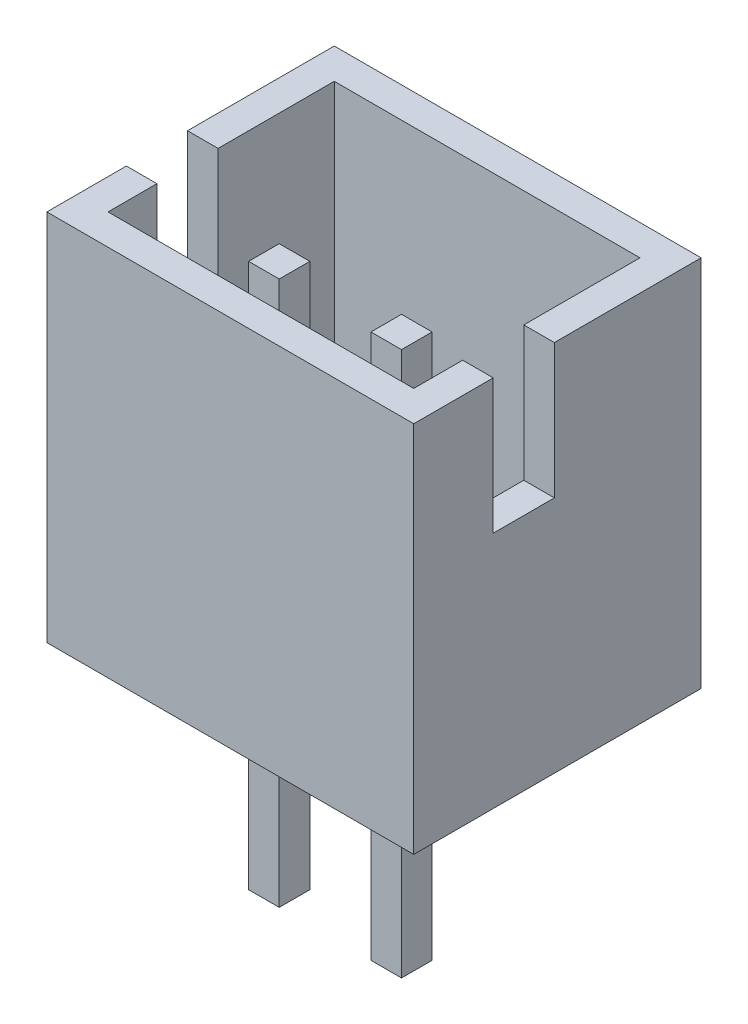
ISO-10303-21;
HEADER;
FILE_DESCRIPTION(('STEP AP214'),'2;1');
FILE_NAME('part.step','',(''),(''),'','','');
FILE_SCHEMA(('AUTOMOTIVE_DESIGN { 1 0 10303 214 1 1 1 1 }'));
ENDSEC;
DATA;
#1=APPLICATION_CONTEXT('core data for automotive mechanical design processes');
#2=APPLICATION_PROTOCOL_DEFINITION('international standard','automotive_design',2000,#1);
#3=PRODUCT_CONTEXT('',#1,'mechanical');
#4=PRODUCT('Part','Part','',(#3));
#5=PRODUCT_RELATED_PRODUCT_CATEGORY('part','',(#4));
#6=PRODUCT_DEFINITION_FORMATION('','',#4);
#7=PRODUCT_DEFINITION_CONTEXT('part definition',#1,'design');
#8=PRODUCT_DEFINITION('design','',#6,#7);
#9=PRODUCT_DEFINITION_SHAPE('','',#8);
#10=(LENGTH_UNIT() NAMED_UNIT(*) SI_UNIT(.MILLI.,.METRE.));
#11=(NAMED_UNIT(*) PLANE_ANGLE_UNIT() SI_UNIT($,.RADIAN.));
#12=(NAMED_UNIT(*) SI_UNIT($,.STERADIAN.) SOLID_ANGLE_UNIT());
#13=UNCERTAINTY_MEASURE_WITH_UNIT(LENGTH_MEASURE(1.E-05),#10,'distance_accuracy_value','');
#14=(GEOMETRIC_REPRESENTATION_CONTEXT(3) GLOBAL_UNCERTAINTY_ASSIGNED_CONTEXT((#13)) GLOBAL_UNIT_ASSIGNED_CONTEXT((#10,
#11,#12)) REPRESENTATION_CONTEXT('',''));
#15=CARTESIAN_POINT('',(0.,0.,0.));
#16=DIRECTION('',(0.,0.,1.));
#17=DIRECTION('',(1.,0.,0.));
#18=AXIS2_PLACEMENT_3D('',#15,#16,#17);
#19=CARTESIAN_POINT('',(0.75,-3.4,0.8));
#20=DIRECTION('',(-1.,0.,0.));
#21=DIRECTION('',(0.,0.,1.));
#22=AXIS2_PLACEMENT_3D('',#19,#20,#21);
#23=PLANE('',#22);
#24=DIRECTION('',(0.,1.,0.));
#25=VECTOR('',#24,1.);
#26=CARTESIAN_POINT('',(0.75,-3.4,0.8));
#27=LINE('',#26,#25);
#28=CARTESIAN_POINT('',(0.75,-3.4,0.8));
#29=VERTEX_POINT('',#28);
#30=CARTESIAN_POINT('',(0.75,5.5,0.8));
#31=VERTEX_POINT('',#30);
#32=EDGE_CURVE('E48',#29,#31,#27,.T.);
#33=ORIENTED_EDGE('',*,*,#32,.T.);
#34=DIRECTION('',(0.,0.,1.));
#35=VECTOR('',#34,1.);
#36=CARTESIAN_POINT('',(0.75,5.5,0.8));
#37=LINE('',#36,#35);
#38=CARTESIAN_POINT('',(0.75,5.5,0.3));
#39=VERTEX_POINT('',#38);
#40=EDGE_CURVE('E85',#39,#31,#37,.T.);
#41=ORIENTED_EDGE('',*,*,#40,.F.);
#42=DIRECTION('',(0.,1.,0.));
#43=VECTOR('',#42,1.);
#44=CARTESIAN_POINT('',(0.75,-3.4,0.3));
#45=LINE('',#44,#43);
#46=CARTESIAN_POINT('',(0.75,-3.4,0.3));
#47=VERTEX_POINT('',#46);
#48=EDGE_CURVE('E12',#47,#39,#45,.T.);
#49=ORIENTED_EDGE('',*,*,#48,.F.);
#50=DIRECTION('',(0.,0.,1.));
#51=VECTOR('',#50,1.);
#52=CARTESIAN_POINT('',(0.75,-3.4,0.8));
#53=LINE('',#52,#51);
#54=EDGE_CURVE('E86',#47,#29,#53,.T.);
#55=ORIENTED_EDGE('',*,*,#54,.T.);
#56=EDGE_LOOP('',(#33,#41,#49,#55));
#57=FACE_BOUND('',#56,.T.);
#58=ADVANCED_FACE('F45',(#57),#23,.T.);
#59=CARTESIAN_POINT('',(0.75,-3.4,0.3));
#60=DIRECTION('',(0.,0.,-1.));
#61=DIRECTION('',(-1.,0.,0.));
#62=AXIS2_PLACEMENT_3D('',#59,#60,#61);
#63=PLANE('',#62);
#64=ORIENTED_EDGE('',*,*,#48,.T.);
#65=DIRECTION('',(-1.,0.,0.));
#66=VECTOR('',#65,1.);
#67=CARTESIAN_POINT('',(0.75,5.5,0.3));
#68=LINE('',#67,#66);
#69=CARTESIAN_POINT('',(1.25,5.5,0.3));
#70=VERTEX_POINT('',#69);
#71=EDGE_CURVE('E102',#70,#39,#68,.T.);
#72=ORIENTED_EDGE('',*,*,#71,.F.);
#73=DIRECTION('',(0.,1.,0.));
#74=VECTOR('',#73,1.);
#75=CARTESIAN_POINT('',(1.25,-3.4,0.3));
#76=LINE('',#75,#74);
#77=CARTESIAN_POINT('',(1.25,-3.4,0.3));
#78=VERTEX_POINT('',#77);
#79=EDGE_CURVE('E53',#78,#70,#76,.T.);
#80=ORIENTED_EDGE('',*,*,#79,.F.);
#81=DIRECTION('',(-1.,0.,0.));
#82=VECTOR('',#81,1.);
#83=CARTESIAN_POINT('',(0.75,-3.4,0.3));
#84=LINE('',#83,#82);
#85=EDGE_CURVE('E91',#78,#47,#84,.T.);
#86=ORIENTED_EDGE('',*,*,#85,.T.);
#87=EDGE_LOOP('',(#64,#72,#80,#86));
#88=FACE_BOUND('',#87,.T.);
#89=ADVANCED_FACE('F117',(#88),#63,.T.);
#90=CARTESIAN_POINT('',(1.25,-3.4,0.800000000000001));
#91=DIRECTION('',(1.,0.,0.));
#92=DIRECTION('',(0.,0.,-1.));
#93=AXIS2_PLACEMENT_3D('',#90,#91,#92);
#94=PLANE('',#93);
#95=ORIENTED_EDGE('',*,*,#79,.T.);
#96=DIRECTION('',(0.,0.,-1.));
#97=VECTOR('',#96,1.);
#98=CARTESIAN_POINT('',(1.25,5.5,0.800000000000001));
#99=LINE('',#98,#97);
#100=CARTESIAN_POINT('',(1.25,5.5,0.800000000000001));
#101=VERTEX_POINT('',#100);
#102=EDGE_CURVE('E98',#101,#70,#99,.T.);
#103=ORIENTED_EDGE('',*,*,#102,.F.);
#104=DIRECTION('',(0.,1.,0.));
#105=VECTOR('',#104,1.);
#106=CARTESIAN_POINT('',(1.25,-3.4,0.800000000000001));
#107=LINE('',#106,#105);
#108=CARTESIAN_POINT('',(1.25,-3.4,0.800000000000001));
#109=VERTEX_POINT('',#108);
#110=EDGE_CURVE('E90',#109,#101,#107,.T.);
#111=ORIENTED_EDGE('',*,*,#110,.F.);
#112=DIRECTION('',(0.,0.,-1.));
#113=VECTOR('',#112,1.);
#114=CARTESIAN_POINT('',(1.25,-3.4,0.800000000000001));
#115=LINE('',#114,#113);
#116=EDGE_CURVE('E110',#109,#78,#115,.T.);
#117=ORIENTED_EDGE('',*,*,#116,.T.);
#118=EDGE_LOOP('',(#95,#103,#111,#117));
#119=FACE_BOUND('',#118,.T.);
#120=ADVANCED_FACE('F114',(#119),#94,.T.);
#121=CARTESIAN_POINT('',(0.75,-3.4,0.8));
#122=DIRECTION('',(0.,0.,1.));
#123=DIRECTION('',(1.,0.,0.));
#124=AXIS2_PLACEMENT_3D('',#121,#122,#123);
#125=PLANE('',#124);
#126=ORIENTED_EDGE('',*,*,#110,.T.);
#127=DIRECTION('',(1.,0.,0.));
#128=VECTOR('',#127,1.);
#129=CARTESIAN_POINT('',(0.75,5.5,0.8));
#130=LINE('',#129,#128);
#131=EDGE_CURVE('E93',#31,#101,#130,.T.);
#132=ORIENTED_EDGE('',*,*,#131,.F.);
#133=ORIENTED_EDGE('',*,*,#32,.F.);
#134=DIRECTION('',(1.,0.,0.));
#135=VECTOR('',#134,1.);
#136=CARTESIAN_POINT('',(0.75,-3.4,0.8));
#137=LINE('',#136,#135);
#138=EDGE_CURVE('E108',#29,#109,#137,.T.);
#139=ORIENTED_EDGE('',*,*,#138,.T.);
#140=EDGE_LOOP('',(#126,#132,#133,#139));
#141=FACE_BOUND('',#140,.T.);
#142=ADVANCED_FACE('F94',(#141),#125,.T.);
#143=CARTESIAN_POINT('',(0.,-3.4,0.));
#144=DIRECTION('',(0.,-1.,0.));
#145=DIRECTION('',(0.,0.,-1.));
#146=AXIS2_PLACEMENT_3D('',#143,#144,#145);
#147=PLANE('',#146);
#148=ORIENTED_EDGE('',*,*,#54,.F.);
#149=ORIENTED_EDGE('',*,*,#85,.F.);
#150=ORIENTED_EDGE('',*,*,#116,.F.);
#151=ORIENTED_EDGE('',*,*,#138,.F.);
#152=EDGE_LOOP('',(#148,#149,#150,#151));
#153=FACE_BOUND('',#152,.T.);
#154=ADVANCED_FACE('F119',(#153),#147,.T.);
#155=CARTESIAN_POINT('',(0.,5.5,0.));
#156=DIRECTION('',(0.,-1.,0.));
#157=DIRECTION('',(0.,0.,-1.));
#158=AXIS2_PLACEMENT_3D('',#155,#156,#157);
#159=PLANE('',#158);
#160=ORIENTED_EDGE('',*,*,#40,.T.);
#161=ORIENTED_EDGE('',*,*,#131,.T.);
#162=ORIENTED_EDGE('',*,*,#102,.T.);
#163=ORIENTED_EDGE('',*,*,#71,.T.);
#164=EDGE_LOOP('',(#160,#161,#162,#163));
#165=FACE_BOUND('',#164,.T.);
#166=ADVANCED_FACE('F101',(#165),#159,.F.);
#167=CLOSED_SHELL('',(#58,#89,#120,#142,#154,#166));
#168=MANIFOLD_SOLID_BREP('B2',#167);
#169=CARTESIAN_POINT('',(-1.25,-3.4,0.800000000000001));
#170=DIRECTION('',(-1.,0.,0.));
#171=DIRECTION('',(0.,0.,1.));
#172=AXIS2_PLACEMENT_3D('',#169,#170,#171);
#173=PLANE('',#172);
#174=DIRECTION('',(0.,1.,0.));
#175=VECTOR('',#174,1.);
#176=CARTESIAN_POINT('',(-1.25,-3.4,0.800000000000001));
#177=LINE('',#176,#175);
#178=CARTESIAN_POINT('',(-1.25,-3.4,0.800000000000001));
#179=VERTEX_POINT('',#178);
#180=CARTESIAN_POINT('',(-1.25,5.5,0.800000000000001));
#181=VERTEX_POINT('',#180);
#182=EDGE_CURVE('E180',#179,#181,#177,.T.);
#183=ORIENTED_EDGE('',*,*,#182,.T.);
#184=DIRECTION('',(0.,0.,1.));
#185=VECTOR('',#184,1.);
#186=CARTESIAN_POINT('',(-1.25,5.5,0.800000000000001));
#187=LINE('',#186,#185);
#188=CARTESIAN_POINT('',(-1.25,5.5,0.3));
#189=VERTEX_POINT('',#188);
#190=EDGE_CURVE('E217',#189,#181,#187,.T.);
#191=ORIENTED_EDGE('',*,*,#190,.F.);
#192=DIRECTION('',(0.,1.,0.));
#193=VECTOR('',#192,1.);
#194=CARTESIAN_POINT('',(-1.25,-3.4,0.3));
#195=LINE('',#194,#193);
#196=CARTESIAN_POINT('',(-1.25,-3.4,0.3));
#197=VERTEX_POINT('',#196);
#198=EDGE_CURVE('E43',#197,#189,#195,.T.);
#199=ORIENTED_EDGE('',*,*,#198,.F.);
#200=DIRECTION('',(0.,0.,1.));
#201=VECTOR('',#200,1.);
#202=CARTESIAN_POINT('',(-1.25,-3.4,0.800000000000001));
#203=LINE('',#202,#201);
#204=EDGE_CURVE('E218',#197,#179,#203,.T.);
#205=ORIENTED_EDGE('',*,*,#204,.T.);
#206=EDGE_LOOP('',(#183,#191,#199,#205));
#207=FACE_BOUND('',#206,.T.);
#208=ADVANCED_FACE('F177',(#207),#173,.T.);
#209=CARTESIAN_POINT('',(-0.75,-3.4,0.3));
#210=DIRECTION('',(0.,0.,-1.));
#211=DIRECTION('',(-1.,0.,0.));
#212=AXIS2_PLACEMENT_3D('',#209,#210,#211);
#213=PLANE('',#212);
#214=ORIENTED_EDGE('',*,*,#198,.T.);
#215=DIRECTION('',(-1.,0.,0.));
#216=VECTOR('',#215,1.);
#217=CARTESIAN_POINT('',(-0.75,5.5,0.3));
#218=LINE('',#217,#216);
#219=CARTESIAN_POINT('',(-0.75,5.5,0.3));
#220=VERTEX_POINT('',#219);
#221=EDGE_CURVE('E234',#220,#189,#218,.T.);
#222=ORIENTED_EDGE('',*,*,#221,.F.);
#223=DIRECTION('',(0.,1.,0.));
#224=VECTOR('',#223,1.);
#225=CARTESIAN_POINT('',(-0.75,-3.4,0.3));
#226=LINE('',#225,#224);
#227=CARTESIAN_POINT('',(-0.75,-3.4,0.3));
#228=VERTEX_POINT('',#227);
#229=EDGE_CURVE('E185',#228,#220,#226,.T.);
#230=ORIENTED_EDGE('',*,*,#229,.F.);
#231=DIRECTION('',(-1.,0.,0.));
#232=VECTOR('',#231,1.);
#233=CARTESIAN_POINT('',(-0.75,-3.4,0.3));
#234=LINE('',#233,#232);
#235=EDGE_CURVE('E223',#228,#197,#234,.T.);
#236=ORIENTED_EDGE('',*,*,#235,.T.);
#237=EDGE_LOOP('',(#214,#222,#230,#236));
#238=FACE_BOUND('',#237,.T.);
#239=ADVANCED_FACE('F249',(#238),#213,.T.);
#240=CARTESIAN_POINT('',(-0.75,-3.4,0.8));
#241=DIRECTION('',(1.,0.,0.));
#242=DIRECTION('',(0.,0.,-1.));
#243=AXIS2_PLACEMENT_3D('',#240,#241,#242);
#244=PLANE('',#243);
#245=ORIENTED_EDGE('',*,*,#229,.T.);
#246=DIRECTION('',(0.,0.,-1.));
#247=VECTOR('',#246,1.);
#248=CARTESIAN_POINT('',(-0.75,5.5,0.8));
#249=LINE('',#248,#247);
#250=CARTESIAN_POINT('',(-0.75,5.5,0.8));
#251=VERTEX_POINT('',#250);
#252=EDGE_CURVE('E230',#251,#220,#249,.T.);
#253=ORIENTED_EDGE('',*,*,#252,.F.);
#254=DIRECTION('',(0.,1.,0.));
#255=VECTOR('',#254,1.);
#256=CARTESIAN_POINT('',(-0.75,-3.4,0.8));
#257=LINE('',#256,#255);
#258=CARTESIAN_POINT('',(-0.75,-3.4,0.8));
#259=VERTEX_POINT('',#258);
#260=EDGE_CURVE('E222',#259,#251,#257,.T.);
#261=ORIENTED_EDGE('',*,*,#260,.F.);
#262=DIRECTION('',(0.,0.,-1.));
#263=VECTOR('',#262,1.);
#264=CARTESIAN_POINT('',(-0.75,-3.4,0.8));
#265=LINE('',#264,#263);
#266=EDGE_CURVE('E242',#259,#228,#265,.T.);
#267=ORIENTED_EDGE('',*,*,#266,.T.);
#268=EDGE_LOOP('',(#245,#253,#261,#267));
#269=FACE_BOUND('',#268,.T.);
#270=ADVANCED_FACE('F246',(#269),#244,.T.);
#271=CARTESIAN_POINT('',(-0.75,-3.4,0.8));
#272=DIRECTION('',(0.,0.,1.));
#273=DIRECTION('',(1.,0.,0.));
#274=AXIS2_PLACEMENT_3D('',#271,#272,#273);
#275=PLANE('',#274);
#276=ORIENTED_EDGE('',*,*,#260,.T.);
#277=DIRECTION('',(1.,0.,0.));
#278=VECTOR('',#277,1.);
#279=CARTESIAN_POINT('',(-0.75,5.5,0.8));
#280=LINE('',#279,#278);
#281=EDGE_CURVE('E225',#181,#251,#280,.T.);
#282=ORIENTED_EDGE('',*,*,#281,.F.);
#283=ORIENTED_EDGE('',*,*,#182,.F.);
#284=DIRECTION('',(1.,0.,0.));
#285=VECTOR('',#284,1.);
#286=CARTESIAN_POINT('',(-0.75,-3.4,0.8));
#287=LINE('',#286,#285);
#288=EDGE_CURVE('E240',#179,#259,#287,.T.);
#289=ORIENTED_EDGE('',*,*,#288,.T.);
#290=EDGE_LOOP('',(#276,#282,#283,#289));
#291=FACE_BOUND('',#290,.T.);
#292=ADVANCED_FACE('F226',(#291),#275,.T.);
#293=CARTESIAN_POINT('',(0.,-3.4,0.));
#294=DIRECTION('',(0.,1.,0.));
#295=DIRECTION('',(0.,0.,1.));
#296=AXIS2_PLACEMENT_3D('',#293,#294,#295);
#297=PLANE('',#296);
#298=ORIENTED_EDGE('',*,*,#204,.F.);
#299=ORIENTED_EDGE('',*,*,#235,.F.);
#300=ORIENTED_EDGE('',*,*,#266,.F.);
#301=ORIENTED_EDGE('',*,*,#288,.F.);
#302=EDGE_LOOP('',(#298,#299,#300,#301));
#303=FACE_BOUND('',#302,.T.);
#304=ADVANCED_FACE('F251',(#303),#297,.F.);
#305=CARTESIAN_POINT('',(0.,5.5,0.));
#306=DIRECTION('',(0.,1.,0.));
#307=DIRECTION('',(0.,0.,1.));
#308=AXIS2_PLACEMENT_3D('',#305,#306,#307);
#309=PLANE('',#308);
#310=ORIENTED_EDGE('',*,*,#190,.T.);
#311=ORIENTED_EDGE('',*,*,#281,.T.);
#312=ORIENTED_EDGE('',*,*,#252,.T.);
#313=ORIENTED_EDGE('',*,*,#221,.T.);
#314=EDGE_LOOP('',(#310,#311,#312,#313));
#315=FACE_BOUND('',#314,.T.);
#316=ADVANCED_FACE('F233',(#315),#309,.T.);
#317=CLOSED_SHELL('',(#208,#239,#270,#292,#304,#316));
#318=MANIFOLD_SOLID_BREP('B6',#317);
#319=CARTESIAN_POINT('',(3.,6.1,2.35));
#320=DIRECTION('',(-1.,0.,0.));
#321=DIRECTION('',(0.,0.,1.));
#322=AXIS2_PLACEMENT_3D('',#319,#320,#321);
#323=PLANE('',#322);
#324=DIRECTION('',(0.,1.,0.));
#325=VECTOR('',#324,1.);
#326=CARTESIAN_POINT('',(3.,3.9,1.05));
#327=LINE('',#326,#325);
#328=CARTESIAN_POINT('',(3.,3.9,1.05));
#329=VERTEX_POINT('',#328);
#330=CARTESIAN_POINT('',(3.,6.1,1.05));
#331=VERTEX_POINT('',#330);
#332=EDGE_CURVE('E419',#329,#331,#327,.T.);
#333=ORIENTED_EDGE('',*,*,#332,.T.);
#334=DIRECTION('',(0.,0.,-1.));
#335=VECTOR('',#334,1.);
#336=CARTESIAN_POINT('',(3.,6.1,2.35));
#337=LINE('',#336,#335);
#338=CARTESIAN_POINT('',(3.,6.1,2.35));
#339=VERTEX_POINT('',#338);
#340=EDGE_CURVE('E435',#339,#331,#337,.T.);
#341=ORIENTED_EDGE('',*,*,#340,.F.);
#342=DIRECTION('',(0.,-1.,0.));
#343=VECTOR('',#342,1.);
#344=CARTESIAN_POINT('',(3.,6.1,2.35));
#345=LINE('',#344,#343);
#346=CARTESIAN_POINT('',(3.,0.,2.35));
#347=VERTEX_POINT('',#346);
#348=EDGE_CURVE('E460',#339,#347,#345,.T.);
#349=ORIENTED_EDGE('',*,*,#348,.T.);
#350=DIRECTION('',(0.,0.,-1.));
#351=VECTOR('',#350,1.);
#352=CARTESIAN_POINT('',(3.,0.,2.35));
#353=LINE('',#352,#351);
#354=CARTESIAN_POINT('',(3.,0.,-2.35));
#355=VERTEX_POINT('',#354);
#356=EDGE_CURVE('E452',#347,#355,#353,.T.);
#357=ORIENTED_EDGE('',*,*,#356,.T.);
#358=DIRECTION('',(0.,-1.,0.));
#359=VECTOR('',#358,1.);
#360=CARTESIAN_POINT('',(3.,6.1,-2.35));
#361=LINE('',#360,#359);
#362=CARTESIAN_POINT('',(3.,6.1,-2.35));
#363=VERTEX_POINT('',#362);
#364=EDGE_CURVE('E433',#363,#355,#361,.T.);
#365=ORIENTED_EDGE('',*,*,#364,.F.);
#366=CARTESIAN_POINT('',(3.,6.1,0.0500000000000005));
#367=VERTEX_POINT('',#366);
#368=EDGE_CURVE('E424',#367,#363,#337,.T.);
#369=ORIENTED_EDGE('',*,*,#368,.F.);
#370=DIRECTION('',(0.,-1.,0.));
#371=VECTOR('',#370,1.);
#372=CARTESIAN_POINT('',(3.,3.9,0.0500000000000005));
#373=LINE('',#372,#371);
#374=CARTESIAN_POINT('',(3.,3.9,0.0500000000000005));
#375=VERTEX_POINT('',#374);
#376=EDGE_CURVE('E411',#367,#375,#373,.T.);
#377=ORIENTED_EDGE('',*,*,#376,.T.);
#378=DIRECTION('',(0.,0.,1.));
#379=VECTOR('',#378,1.);
#380=CARTESIAN_POINT('',(3.,3.9,1.05));
#381=LINE('',#380,#379);
#382=EDGE_CURVE('E429',#375,#329,#381,.T.);
#383=ORIENTED_EDGE('',*,*,#382,.T.);
#384=EDGE_LOOP('',(#333,#341,#349,#357,#365,#369,#377,#383));
#385=FACE_BOUND('',#384,.T.);
#386=ADVANCED_FACE('F300',(#385),#323,.F.);
#387=CARTESIAN_POINT('',(0.,6.1,0.));
#388=DIRECTION('',(0.,1.,0.));
#389=DIRECTION('',(0.,0.,1.));
#390=AXIS2_PLACEMENT_3D('',#387,#388,#389);
#391=PLANE('',#390);
#392=ORIENTED_EDGE('',*,*,#340,.T.);
#393=DIRECTION('',(1.,0.,0.));
#394=VECTOR('',#393,1.);
#395=CARTESIAN_POINT('',(-4.91660919471891,6.1,1.05));
#396=LINE('',#395,#394);
#397=CARTESIAN_POINT('',(2.5,6.1,1.05));
#398=VERTEX_POINT('',#397);
#399=EDGE_CURVE('E428',#398,#331,#396,.T.);
#400=ORIENTED_EDGE('',*,*,#399,.F.);
#401=DIRECTION('',(0.,0.,-1.));
#402=VECTOR('',#401,1.);
#403=CARTESIAN_POINT('',(2.5,6.1,2.35));
#404=LINE('',#403,#402);
#405=CARTESIAN_POINT('',(2.5,6.1,1.85));
#406=VERTEX_POINT('',#405);
#407=EDGE_CURVE('E535',#406,#398,#404,.T.);
#408=ORIENTED_EDGE('',*,*,#407,.F.);
#409=DIRECTION('',(1.,0.,0.));
#410=VECTOR('',#409,1.);
#411=CARTESIAN_POINT('',(3.,6.1,1.85));
#412=LINE('',#411,#410);
#413=CARTESIAN_POINT('',(-2.5,6.1,1.85));
#414=VERTEX_POINT('',#413);
#415=EDGE_CURVE('E533',#414,#406,#412,.T.);
#416=ORIENTED_EDGE('',*,*,#415,.F.);
#417=DIRECTION('',(0.,0.,1.));
#418=VECTOR('',#417,1.);
#419=CARTESIAN_POINT('',(-2.5,6.1,2.35));
#420=LINE('',#419,#418);
#421=CARTESIAN_POINT('',(-2.5,6.1,1.05));
#422=VERTEX_POINT('',#421);
#423=EDGE_CURVE('E529',#422,#414,#420,.T.);
#424=ORIENTED_EDGE('',*,*,#423,.F.);
#425=DIRECTION('',(-1.,0.,0.));
#426=VECTOR('',#425,1.);
#427=CARTESIAN_POINT('',(-0.0833908052810871,6.1,1.05));
#428=LINE('',#427,#426);
#429=CARTESIAN_POINT('',(-3.,6.1,1.05));
#430=VERTEX_POINT('',#429);
#431=EDGE_CURVE('E502',#422,#430,#428,.T.);
#432=ORIENTED_EDGE('',*,*,#431,.T.);
#433=DIRECTION('',(0.,0.,1.));
#434=VECTOR('',#433,1.);
#435=CARTESIAN_POINT('',(-3.,6.1,2.35));
#436=LINE('',#435,#434);
#437=CARTESIAN_POINT('',(-3.,6.1,2.35));
#438=VERTEX_POINT('',#437);
#439=EDGE_CURVE('E456',#430,#438,#436,.T.);
#440=ORIENTED_EDGE('',*,*,#439,.T.);
#441=DIRECTION('',(1.,0.,0.));
#442=VECTOR('',#441,1.);
#443=CARTESIAN_POINT('',(3.,6.1,2.35));
#444=LINE('',#443,#442);
#445=EDGE_CURVE('E436',#438,#339,#444,.T.);
#446=ORIENTED_EDGE('',*,*,#445,.T.);
#447=EDGE_LOOP('',(#392,#400,#408,#416,#424,#432,#440,#446));
#448=FACE_BOUND('',#447,.T.);
#449=ADVANCED_FACE('F543',(#448),#391,.T.);
#450=CARTESIAN_POINT('',(2.5,6.1,0.0500000000000006));
#451=VERTEX_POINT('',#450);
#452=CARTESIAN_POINT('',(2.5,6.1,-1.85));
#453=VERTEX_POINT('',#452);
#454=EDGE_CURVE('E427',#451,#453,#404,.T.);
#455=ORIENTED_EDGE('',*,*,#454,.F.);
#456=DIRECTION('',(1.,0.,0.));
#457=VECTOR('',#456,1.);
#458=CARTESIAN_POINT('',(-4.91660919471891,6.1,0.0500000000000005));
#459=LINE('',#458,#457);
#460=EDGE_CURVE('E315',#451,#367,#459,.T.);
#461=ORIENTED_EDGE('',*,*,#460,.T.);
#462=ORIENTED_EDGE('',*,*,#368,.T.);
#463=DIRECTION('',(-1.,0.,0.));
#464=VECTOR('',#463,1.);
#465=CARTESIAN_POINT('',(3.,6.1,-2.35));
#466=LINE('',#465,#464);
#467=CARTESIAN_POINT('',(-3.,6.1,-2.35));
#468=VERTEX_POINT('',#467);
#469=EDGE_CURVE('E439',#363,#468,#466,.T.);
#470=ORIENTED_EDGE('',*,*,#469,.T.);
#471=CARTESIAN_POINT('',(-3.,6.1,0.0500000000000005));
#472=VERTEX_POINT('',#471);
#473=EDGE_CURVE('E440',#468,#472,#436,.T.);
#474=ORIENTED_EDGE('',*,*,#473,.T.);
#475=DIRECTION('',(-1.,0.,0.));
#476=VECTOR('',#475,1.);
#477=CARTESIAN_POINT('',(-0.0833908052810871,6.1,0.0500000000000005));
#478=LINE('',#477,#476);
#479=CARTESIAN_POINT('',(-2.5,6.1,0.0500000000000003));
#480=VERTEX_POINT('',#479);
#481=EDGE_CURVE('E498',#480,#472,#478,.T.);
#482=ORIENTED_EDGE('',*,*,#481,.F.);
#483=CARTESIAN_POINT('',(-2.5,6.1,-1.85));
#484=VERTEX_POINT('',#483);
#485=EDGE_CURVE('E530',#484,#480,#420,.T.);
#486=ORIENTED_EDGE('',*,*,#485,.F.);
#487=DIRECTION('',(-1.,0.,0.));
#488=VECTOR('',#487,1.);
#489=CARTESIAN_POINT('',(3.,6.1,-1.85));
#490=LINE('',#489,#488);
#491=EDGE_CURVE('E519',#453,#484,#490,.T.);
#492=ORIENTED_EDGE('',*,*,#491,.F.);
#493=EDGE_LOOP('',(#455,#461,#462,#470,#474,#482,#486,#492));
#494=FACE_BOUND('',#493,.T.);
#495=ADVANCED_FACE('F423',(#494),#391,.T.);
#496=CARTESIAN_POINT('',(2.5,6.1,2.35));
#497=DIRECTION('',(-1.,0.,0.));
#498=DIRECTION('',(0.,0.,1.));
#499=AXIS2_PLACEMENT_3D('',#496,#497,#498);
#500=PLANE('',#499);
#501=ORIENTED_EDGE('',*,*,#407,.T.);
#502=DIRECTION('',(0.,-1.,0.));
#503=VECTOR('',#502,1.);
#504=CARTESIAN_POINT('',(2.5,6.1,1.05));
#505=LINE('',#504,#503);
#506=CARTESIAN_POINT('',(2.5,3.9,1.05));
#507=VERTEX_POINT('',#506);
#508=EDGE_CURVE('E175',#398,#507,#505,.T.);
#509=ORIENTED_EDGE('',*,*,#508,.T.);
#510=DIRECTION('',(0.,0.,-1.));
#511=VECTOR('',#510,1.);
#512=CARTESIAN_POINT('',(2.5,3.9,2.35));
#513=LINE('',#512,#511);
#514=CARTESIAN_POINT('',(2.5,3.9,0.0500000000000005));
#515=VERTEX_POINT('',#514);
#516=EDGE_CURVE('E308',#507,#515,#513,.T.);
#517=ORIENTED_EDGE('',*,*,#516,.T.);
#518=DIRECTION('',(0.,1.,0.));
#519=VECTOR('',#518,1.);
#520=CARTESIAN_POINT('',(2.5,6.1,0.0500000000000006));
#521=LINE('',#520,#519);
#522=EDGE_CURVE('E466',#515,#451,#521,.T.);
#523=ORIENTED_EDGE('',*,*,#522,.T.);
#524=ORIENTED_EDGE('',*,*,#454,.T.);
#525=DIRECTION('',(0.,-1.,0.));
#526=VECTOR('',#525,1.);
#527=CARTESIAN_POINT('',(2.5,6.1,-1.85));
#528=LINE('',#527,#526);
#529=CARTESIAN_POINT('',(2.5,0.5,-1.85));
#530=VERTEX_POINT('',#529);
#531=EDGE_CURVE('E518',#453,#530,#528,.T.);
#532=ORIENTED_EDGE('',*,*,#531,.T.);
#533=DIRECTION('',(0.,0.,-1.));
#534=VECTOR('',#533,1.);
#535=CARTESIAN_POINT('',(2.5,0.5,2.35));
#536=LINE('',#535,#534);
#537=CARTESIAN_POINT('',(2.5,0.5,1.85));
#538=VERTEX_POINT('',#537);
#539=EDGE_CURVE('E521',#538,#530,#536,.T.);
#540=ORIENTED_EDGE('',*,*,#539,.F.);
#541=DIRECTION('',(0.,-1.,0.));
#542=VECTOR('',#541,1.);
#543=CARTESIAN_POINT('',(2.5,6.1,1.85));
#544=LINE('',#543,#542);
#545=EDGE_CURVE('E514',#406,#538,#544,.T.);
#546=ORIENTED_EDGE('',*,*,#545,.F.);
#547=EDGE_LOOP('',(#501,#509,#517,#523,#524,#532,#540,#546));
#548=FACE_BOUND('',#547,.T.);
#549=ADVANCED_FACE('F470',(#548),#500,.T.);
#550=CARTESIAN_POINT('',(-3.,6.1,2.35));
#551=DIRECTION('',(1.,0.,0.));
#552=DIRECTION('',(0.,0.,-1.));
#553=AXIS2_PLACEMENT_3D('',#550,#551,#552);
#554=PLANE('',#553);
#555=ORIENTED_EDGE('',*,*,#439,.F.);
#556=DIRECTION('',(0.,1.,0.));
#557=VECTOR('',#556,1.);
#558=CARTESIAN_POINT('',(-3.,3.9,1.05));
#559=LINE('',#558,#557);
#560=CARTESIAN_POINT('',(-3.,3.9,1.05));
#561=VERTEX_POINT('',#560);
#562=EDGE_CURVE('E485',#561,#430,#559,.T.);
#563=ORIENTED_EDGE('',*,*,#562,.F.);
#564=DIRECTION('',(0.,0.,1.));
#565=VECTOR('',#564,1.);
#566=CARTESIAN_POINT('',(-3.,3.9,1.05));
#567=LINE('',#566,#565);
#568=CARTESIAN_POINT('',(-3.,3.9,0.0500000000000005));
#569=VERTEX_POINT('',#568);
#570=EDGE_CURVE('E488',#569,#561,#567,.T.);
#571=ORIENTED_EDGE('',*,*,#570,.F.);
#572=DIRECTION('',(0.,-1.,0.));
#573=VECTOR('',#572,1.);
#574=CARTESIAN_POINT('',(-3.,3.9,0.0500000000000005));
#575=LINE('',#574,#573);
#576=EDGE_CURVE('E480',#472,#569,#575,.T.);
#577=ORIENTED_EDGE('',*,*,#576,.F.);
#578=ORIENTED_EDGE('',*,*,#473,.F.);
#579=DIRECTION('',(0.,-1.,0.));
#580=VECTOR('',#579,1.);
#581=CARTESIAN_POINT('',(-3.,6.1,-2.35));
#582=LINE('',#581,#580);
#583=CARTESIAN_POINT('',(-3.,0.,-2.35));
#584=VERTEX_POINT('',#583);
#585=EDGE_CURVE('E445',#468,#584,#582,.T.);
#586=ORIENTED_EDGE('',*,*,#585,.T.);
#587=DIRECTION('',(0.,0.,1.));
#588=VECTOR('',#587,1.);
#589=CARTESIAN_POINT('',(-3.,0.,2.35));
#590=LINE('',#589,#588);
#591=CARTESIAN_POINT('',(-3.,0.,2.35));
#592=VERTEX_POINT('',#591);
#593=EDGE_CURVE('E446',#584,#592,#590,.T.);
#594=ORIENTED_EDGE('',*,*,#593,.T.);
#595=DIRECTION('',(0.,-1.,0.));
#596=VECTOR('',#595,1.);
#597=CARTESIAN_POINT('',(-3.,6.1,2.35));
#598=LINE('',#597,#596);
#599=EDGE_CURVE('E463',#438,#592,#598,.T.);
#600=ORIENTED_EDGE('',*,*,#599,.F.);
#601=EDGE_LOOP('',(#555,#563,#571,#577,#578,#586,#594,#600));
#602=FACE_BOUND('',#601,.T.);
#603=ADVANCED_FACE('F302',(#602),#554,.F.);
#604=CARTESIAN_POINT('',(3.,6.1,2.35));
#605=DIRECTION('',(0.,0.,-1.));
#606=DIRECTION('',(-1.,0.,0.));
#607=AXIS2_PLACEMENT_3D('',#604,#605,#606);
#608=PLANE('',#607);
#609=DIRECTION('',(1.,0.,0.));
#610=VECTOR('',#609,1.);
#611=CARTESIAN_POINT('',(3.,0.,2.35));
#612=LINE('',#611,#610);
#613=EDGE_CURVE('E449',#592,#347,#612,.T.);
#614=ORIENTED_EDGE('',*,*,#613,.T.);
#615=ORIENTED_EDGE('',*,*,#348,.F.);
#616=ORIENTED_EDGE('',*,*,#445,.F.);
#617=ORIENTED_EDGE('',*,*,#599,.T.);
#618=EDGE_LOOP('',(#614,#615,#616,#617));
#619=FACE_BOUND('',#618,.T.);
#620=ADVANCED_FACE('F550',(#619),#608,.F.);
#621=CARTESIAN_POINT('',(3.,6.1,-2.35));
#622=DIRECTION('',(0.,0.,1.));
#623=DIRECTION('',(1.,0.,0.));
#624=AXIS2_PLACEMENT_3D('',#621,#622,#623);
#625=PLANE('',#624);
#626=DIRECTION('',(-1.,0.,0.));
#627=VECTOR('',#626,1.);
#628=CARTESIAN_POINT('',(3.,0.,-2.35));
#629=LINE('',#628,#627);
#630=EDGE_CURVE('E454',#355,#584,#629,.T.);
#631=ORIENTED_EDGE('',*,*,#630,.T.);
#632=ORIENTED_EDGE('',*,*,#585,.F.);
#633=ORIENTED_EDGE('',*,*,#469,.F.);
#634=ORIENTED_EDGE('',*,*,#364,.T.);
#635=EDGE_LOOP('',(#631,#632,#633,#634));
#636=FACE_BOUND('',#635,.T.);
#637=ADVANCED_FACE('F599',(#636),#625,.F.);
#638=CARTESIAN_POINT('',(0.,0.,0.));
#639=DIRECTION('',(0.,1.,0.));
#640=DIRECTION('',(0.,0.,1.));
#641=AXIS2_PLACEMENT_3D('',#638,#639,#640);
#642=PLANE('',#641);
#643=ORIENTED_EDGE('',*,*,#593,.F.);
#644=ORIENTED_EDGE('',*,*,#630,.F.);
#645=ORIENTED_EDGE('',*,*,#356,.F.);
#646=ORIENTED_EDGE('',*,*,#613,.F.);
#647=EDGE_LOOP('',(#643,#644,#645,#646));
#648=FACE_BOUND('',#647,.T.);
#649=ADVANCED_FACE('F556',(#648),#642,.F.);
#650=CARTESIAN_POINT('',(-2.5,6.1,2.35));
#651=DIRECTION('',(1.,0.,0.));
#652=DIRECTION('',(0.,0.,-1.));
#653=AXIS2_PLACEMENT_3D('',#650,#651,#652);
#654=PLANE('',#653);
#655=DIRECTION('',(0.,1.,0.));
#656=VECTOR('',#655,1.);
#657=CARTESIAN_POINT('',(-2.5,3.9,1.05));
#658=LINE('',#657,#656);
#659=CARTESIAN_POINT('',(-2.5,3.9,1.05));
#660=VERTEX_POINT('',#659);
#661=EDGE_CURVE('E499',#660,#422,#658,.T.);
#662=ORIENTED_EDGE('',*,*,#661,.T.);
#663=ORIENTED_EDGE('',*,*,#423,.T.);
#664=DIRECTION('',(0.,-1.,0.));
#665=VECTOR('',#664,1.);
#666=CARTESIAN_POINT('',(-2.5,6.1,1.85));
#667=LINE('',#666,#665);
#668=CARTESIAN_POINT('',(-2.5,0.5,1.85));
#669=VERTEX_POINT('',#668);
#670=EDGE_CURVE('E450',#414,#669,#667,.T.);
#671=ORIENTED_EDGE('',*,*,#670,.T.);
#672=DIRECTION('',(0.,0.,1.));
#673=VECTOR('',#672,1.);
#674=CARTESIAN_POINT('',(-2.5,0.5,2.35));
#675=LINE('',#674,#673);
#676=CARTESIAN_POINT('',(-2.5,0.5,-1.85));
#677=VERTEX_POINT('',#676);
#678=EDGE_CURVE('E508',#677,#669,#675,.T.);
#679=ORIENTED_EDGE('',*,*,#678,.F.);
#680=DIRECTION('',(0.,-1.,0.));
#681=VECTOR('',#680,1.);
#682=CARTESIAN_POINT('',(-2.5,6.1,-1.85));
#683=LINE('',#682,#681);
#684=EDGE_CURVE('E515',#484,#677,#683,.T.);
#685=ORIENTED_EDGE('',*,*,#684,.F.);
#686=ORIENTED_EDGE('',*,*,#485,.T.);
#687=DIRECTION('',(0.,-1.,0.));
#688=VECTOR('',#687,1.);
#689=CARTESIAN_POINT('',(-2.5,3.9,0.0500000000000005));
#690=LINE('',#689,#688);
#691=CARTESIAN_POINT('',(-2.5,3.9,0.0500000000000006));
#692=VERTEX_POINT('',#691);
#693=EDGE_CURVE('E495',#480,#692,#690,.T.);
#694=ORIENTED_EDGE('',*,*,#693,.T.);
#695=DIRECTION('',(0.,0.,1.));
#696=VECTOR('',#695,1.);
#697=CARTESIAN_POINT('',(-2.5,3.9,1.05));
#698=LINE('',#697,#696);
#699=EDGE_CURVE('E487',#692,#660,#698,.T.);
#700=ORIENTED_EDGE('',*,*,#699,.T.);
#701=EDGE_LOOP('',(#662,#663,#671,#679,#685,#686,#694,#700));
#702=FACE_BOUND('',#701,.T.);
#703=ADVANCED_FACE('F566',(#702),#654,.T.);
#704=CARTESIAN_POINT('',(3.,6.1,1.85));
#705=DIRECTION('',(0.,0.,-1.));
#706=DIRECTION('',(-1.,0.,0.));
#707=AXIS2_PLACEMENT_3D('',#704,#705,#706);
#708=PLANE('',#707);
#709=DIRECTION('',(1.,0.,0.));
#710=VECTOR('',#709,1.);
#711=CARTESIAN_POINT('',(3.,0.5,1.85));
#712=LINE('',#711,#710);
#713=EDGE_CURVE('E511',#669,#538,#712,.T.);
#714=ORIENTED_EDGE('',*,*,#713,.F.);
#715=ORIENTED_EDGE('',*,*,#670,.F.);
#716=ORIENTED_EDGE('',*,*,#415,.T.);
#717=ORIENTED_EDGE('',*,*,#545,.T.);
#718=EDGE_LOOP('',(#714,#715,#716,#717));
#719=FACE_BOUND('',#718,.T.);
#720=ADVANCED_FACE('F563',(#719),#708,.T.);
#721=CARTESIAN_POINT('',(3.,6.1,-1.85));
#722=DIRECTION('',(0.,0.,1.));
#723=DIRECTION('',(1.,0.,0.));
#724=AXIS2_PLACEMENT_3D('',#721,#722,#723);
#725=PLANE('',#724);
#726=DIRECTION('',(-1.,0.,0.));
#727=VECTOR('',#726,1.);
#728=CARTESIAN_POINT('',(3.,0.5,-1.85));
#729=LINE('',#728,#727);
#730=EDGE_CURVE('E525',#530,#677,#729,.T.);
#731=ORIENTED_EDGE('',*,*,#730,.F.);
#732=ORIENTED_EDGE('',*,*,#531,.F.);
#733=ORIENTED_EDGE('',*,*,#491,.T.);
#734=ORIENTED_EDGE('',*,*,#684,.T.);
#735=EDGE_LOOP('',(#731,#732,#733,#734));
#736=FACE_BOUND('',#735,.T.);
#737=ADVANCED_FACE('F580',(#736),#725,.T.);
#738=CARTESIAN_POINT('',(0.,0.5,0.));
#739=DIRECTION('',(0.,1.,0.));
#740=DIRECTION('',(0.,0.,1.));
#741=AXIS2_PLACEMENT_3D('',#738,#739,#740);
#742=PLANE('',#741);
#743=ORIENTED_EDGE('',*,*,#678,.T.);
#744=ORIENTED_EDGE('',*,*,#713,.T.);
#745=ORIENTED_EDGE('',*,*,#539,.T.);
#746=ORIENTED_EDGE('',*,*,#730,.T.);
#747=EDGE_LOOP('',(#743,#744,#745,#746));
#748=FACE_BOUND('',#747,.T.);
#749=ADVANCED_FACE('F583',(#748),#742,.T.);
#750=CARTESIAN_POINT('',(-0.0833908052810871,3.9,1.05));
#751=DIRECTION('',(0.,-1.,0.));
#752=DIRECTION('',(0.,0.,-1.));
#753=AXIS2_PLACEMENT_3D('',#750,#751,#752);
#754=PLANE('',#753);
#755=DIRECTION('',(-1.,0.,0.));
#756=VECTOR('',#755,1.);
#757=CARTESIAN_POINT('',(-0.0833908052810871,3.9,0.0500000000000005));
#758=LINE('',#757,#756);
#759=EDGE_CURVE('E323',#692,#569,#758,.T.);
#760=ORIENTED_EDGE('',*,*,#759,.T.);
#761=ORIENTED_EDGE('',*,*,#570,.T.);
#762=DIRECTION('',(-1.,0.,0.));
#763=VECTOR('',#762,1.);
#764=CARTESIAN_POINT('',(-0.0833908052810871,3.9,1.05));
#765=LINE('',#764,#763);
#766=EDGE_CURVE('E494',#660,#561,#765,.T.);
#767=ORIENTED_EDGE('',*,*,#766,.F.);
#768=ORIENTED_EDGE('',*,*,#699,.F.);
#769=EDGE_LOOP('',(#760,#761,#767,#768));
#770=FACE_BOUND('',#769,.T.);
#771=ADVANCED_FACE('F572',(#770),#754,.F.);
#772=CARTESIAN_POINT('',(-0.0833908052810871,3.9,1.05));
#773=DIRECTION('',(0.,0.,1.));
#774=DIRECTION('',(1.,0.,0.));
#775=AXIS2_PLACEMENT_3D('',#772,#773,#774);
#776=PLANE('',#775);
#777=ORIENTED_EDGE('',*,*,#766,.T.);
#778=ORIENTED_EDGE('',*,*,#562,.T.);
#779=ORIENTED_EDGE('',*,*,#431,.F.);
#780=ORIENTED_EDGE('',*,*,#661,.F.);
#781=EDGE_LOOP('',(#777,#778,#779,#780));
#782=FACE_BOUND('',#781,.T.);
#783=ADVANCED_FACE('F570',(#782),#776,.F.);
#784=CARTESIAN_POINT('',(-0.0833908052810871,3.9,0.0500000000000005));
#785=DIRECTION('',(0.,0.,-1.));
#786=DIRECTION('',(-1.,0.,0.));
#787=AXIS2_PLACEMENT_3D('',#784,#785,#786);
#788=PLANE('',#787);
#789=ORIENTED_EDGE('',*,*,#481,.T.);
#790=ORIENTED_EDGE('',*,*,#576,.T.);
#791=ORIENTED_EDGE('',*,*,#759,.F.);
#792=ORIENTED_EDGE('',*,*,#693,.F.);
#793=EDGE_LOOP('',(#789,#790,#791,#792));
#794=FACE_BOUND('',#793,.T.);
#795=ADVANCED_FACE('F575',(#794),#788,.F.);
#796=CARTESIAN_POINT('',(-4.91660919471891,3.9,1.05));
#797=DIRECTION('',(0.,0.,-1.));
#798=DIRECTION('',(-1.,0.,0.));
#799=AXIS2_PLACEMENT_3D('',#796,#797,#798);
#800=PLANE('',#799);
#801=ORIENTED_EDGE('',*,*,#399,.T.);
#802=ORIENTED_EDGE('',*,*,#332,.F.);
#803=DIRECTION('',(1.,0.,0.));
#804=VECTOR('',#803,1.);
#805=CARTESIAN_POINT('',(-4.91660919471891,3.9,1.05));
#806=LINE('',#805,#804);
#807=EDGE_CURVE('E474',#507,#329,#806,.T.);
#808=ORIENTED_EDGE('',*,*,#807,.F.);
#809=ORIENTED_EDGE('',*,*,#508,.F.);
#810=EDGE_LOOP('',(#801,#802,#808,#809));
#811=FACE_BOUND('',#810,.T.);
#812=ADVANCED_FACE('F477',(#811),#800,.T.);
#813=CARTESIAN_POINT('',(-4.91660919471891,3.9,1.05));
#814=DIRECTION('',(0.,1.,0.));
#815=DIRECTION('',(0.,0.,1.));
#816=AXIS2_PLACEMENT_3D('',#813,#814,#815);
#817=PLANE('',#816);
#818=ORIENTED_EDGE('',*,*,#807,.T.);
#819=ORIENTED_EDGE('',*,*,#382,.F.);
#820=DIRECTION('',(1.,0.,0.));
#821=VECTOR('',#820,1.);
#822=CARTESIAN_POINT('',(-4.91660919471891,3.9,0.0500000000000005));
#823=LINE('',#822,#821);
#824=EDGE_CURVE('E414',#515,#375,#823,.T.);
#825=ORIENTED_EDGE('',*,*,#824,.F.);
#826=ORIENTED_EDGE('',*,*,#516,.F.);
#827=EDGE_LOOP('',(#818,#819,#825,#826));
#828=FACE_BOUND('',#827,.T.);
#829=ADVANCED_FACE('F473',(#828),#817,.T.);
#830=CARTESIAN_POINT('',(-4.91660919471891,3.9,0.0500000000000005));
#831=DIRECTION('',(0.,0.,1.));
#832=DIRECTION('',(1.,0.,0.));
#833=AXIS2_PLACEMENT_3D('',#830,#831,#832);
#834=PLANE('',#833);
#835=ORIENTED_EDGE('',*,*,#824,.T.);
#836=ORIENTED_EDGE('',*,*,#376,.F.);
#837=ORIENTED_EDGE('',*,*,#460,.F.);
#838=ORIENTED_EDGE('',*,*,#522,.F.);
#839=EDGE_LOOP('',(#835,#836,#837,#838));
#840=FACE_BOUND('',#839,.T.);
#841=ADVANCED_FACE('F412',(#840),#834,.T.);
#842=CLOSED_SHELL('',(#386,#449,#495,#549,#603,#620,#637,#649,#703,#720,#737,#749,#771,#783,
#795,#812,#829,#841));
#843=MANIFOLD_SOLID_BREP('B37',#842);
#844=ADVANCED_BREP_SHAPE_REPRESENTATION('',(#18,#168,#318,#843),#14);
#845=SHAPE_DEFINITION_REPRESENTATION(#9,#844);
ENDSEC;
END-ISO-10303-21;
